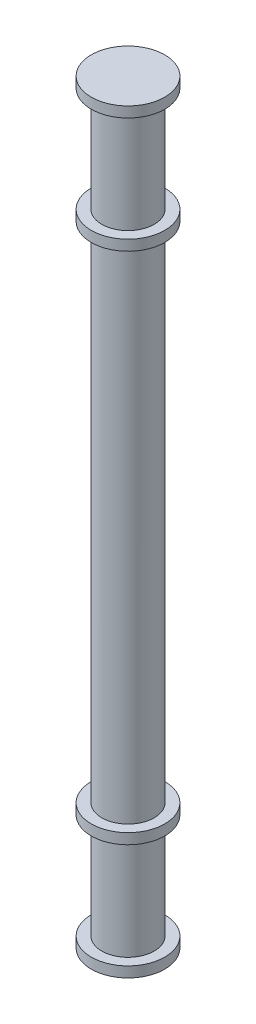
ISO-10303-21;
HEADER;
FILE_DESCRIPTION(('STEP AP214'),'2;1');
FILE_NAME('part.step','',(''),(''),'','','');
FILE_SCHEMA(('AUTOMOTIVE_DESIGN { 1 0 10303 214 1 1 1 1 }'));
ENDSEC;
DATA;
#1=APPLICATION_CONTEXT('core data for automotive mechanical design processes');
#2=APPLICATION_PROTOCOL_DEFINITION('international standard','automotive_design',2000,#1);
#3=PRODUCT_CONTEXT('',#1,'mechanical');
#4=PRODUCT('Part','Part','',(#3));
#5=PRODUCT_RELATED_PRODUCT_CATEGORY('part','',(#4));
#6=PRODUCT_DEFINITION_FORMATION('','',#4);
#7=PRODUCT_DEFINITION_CONTEXT('part definition',#1,'design');
#8=PRODUCT_DEFINITION('design','',#6,#7);
#9=PRODUCT_DEFINITION_SHAPE('','',#8);
#10=(LENGTH_UNIT() NAMED_UNIT(*) SI_UNIT(.MILLI.,.METRE.));
#11=(NAMED_UNIT(*) PLANE_ANGLE_UNIT() SI_UNIT($,.RADIAN.));
#12=(NAMED_UNIT(*) SI_UNIT($,.STERADIAN.) SOLID_ANGLE_UNIT());
#13=UNCERTAINTY_MEASURE_WITH_UNIT(LENGTH_MEASURE(1.E-05),#10,'distance_accuracy_value','');
#14=(GEOMETRIC_REPRESENTATION_CONTEXT(3) GLOBAL_UNCERTAINTY_ASSIGNED_CONTEXT((#13)) GLOBAL_UNIT_ASSIGNED_CONTEXT((#10,
#11,#12)) REPRESENTATION_CONTEXT('',''));
#15=CARTESIAN_POINT('',(0.,0.,0.));
#16=DIRECTION('',(0.,0.,1.));
#17=DIRECTION('',(1.,0.,0.));
#18=AXIS2_PLACEMENT_3D('',#15,#16,#17);
#19=CARTESIAN_POINT('',(0.,120.,1.15660100583352));
#20=DIRECTION('',(0.,1.,0.));
#21=DIRECTION('',(0.,0.,1.));
#22=AXIS2_PLACEMENT_3D('',#19,#20,#21);
#23=CYLINDRICAL_SURFACE('',#22,7.);
#24=CARTESIAN_POINT('',(0.,120.,1.15660100583352));
#25=DIRECTION('',(0.,1.,0.));
#26=DIRECTION('',(1.,0.,0.));
#27=AXIS2_PLACEMENT_3D('',#24,#25,#26);
#28=CIRCLE('',#27,7.);
#29=CARTESIAN_POINT('',(7.,120.,1.15660100583352));
#30=VERTEX_POINT('',#29);
#31=EDGE_CURVE('E12',#30,#30,#28,.T.);
#32=ORIENTED_EDGE('',*,*,#31,.T.);
#33=EDGE_LOOP('',(#32));
#34=FACE_BOUND('',#33,.T.);
#35=CARTESIAN_POINT('',(0.,122.,1.15660100583352));
#36=DIRECTION('',(0.,1.,0.));
#37=DIRECTION('',(1.,0.,0.));
#38=AXIS2_PLACEMENT_3D('',#35,#36,#37);
#39=CIRCLE('',#38,7.);
#40=CARTESIAN_POINT('',(7.,122.,1.15660100583352));
#41=VERTEX_POINT('',#40);
#42=EDGE_CURVE('E72',#41,#41,#39,.T.);
#43=ORIENTED_EDGE('',*,*,#42,.F.);
#44=EDGE_LOOP('',(#43));
#45=FACE_BOUND('',#44,.T.);
#46=ADVANCED_FACE('F69',(#34,#45),#23,.T.);
#47=CARTESIAN_POINT('',(0.,120.,1.15660100583352));
#48=DIRECTION('',(0.,1.,0.));
#49=DIRECTION('',(0.,0.,1.));
#50=AXIS2_PLACEMENT_3D('',#47,#48,#49);
#51=PLANE('',#50);
#52=CARTESIAN_POINT('',(0.,120.,1.15660100583352));
#53=DIRECTION('',(0.,1.,0.));
#54=DIRECTION('',(0.,0.,1.));
#55=AXIS2_PLACEMENT_3D('',#52,#53,#54);
#56=CIRCLE('',#55,5.);
#57=CARTESIAN_POINT('',(0.,120.,6.15660100583352));
#58=VERTEX_POINT('',#57);
#59=EDGE_CURVE('E79',#58,#58,#56,.T.);
#60=ORIENTED_EDGE('',*,*,#59,.T.);
#61=EDGE_LOOP('',(#60));
#62=FACE_BOUND('',#61,.T.);
#63=ORIENTED_EDGE('',*,*,#31,.F.);
#64=EDGE_LOOP('',(#63));
#65=FACE_BOUND('',#64,.T.);
#66=ADVANCED_FACE('F87',(#62,#65),#51,.F.);
#67=CARTESIAN_POINT('',(0.,122.,1.15660100583352));
#68=DIRECTION('',(0.,1.,0.));
#69=DIRECTION('',(0.,0.,1.));
#70=AXIS2_PLACEMENT_3D('',#67,#68,#69);
#71=PLANE('',#70);
#72=CARTESIAN_POINT('',(0.,122.,1.15660100583352));
#73=DIRECTION('',(0.,1.,0.));
#74=DIRECTION('',(0.,0.,1.));
#75=AXIS2_PLACEMENT_3D('',#72,#73,#74);
#76=CIRCLE('',#75,5.);
#77=CARTESIAN_POINT('',(0.,122.,6.15660100583352));
#78=VERTEX_POINT('',#77);
#79=EDGE_CURVE('E81',#78,#78,#76,.T.);
#80=ORIENTED_EDGE('',*,*,#79,.F.);
#81=EDGE_LOOP('',(#80));
#82=FACE_BOUND('',#81,.T.);
#83=ORIENTED_EDGE('',*,*,#42,.T.);
#84=EDGE_LOOP('',(#83));
#85=FACE_BOUND('',#84,.T.);
#86=ADVANCED_FACE('F93',(#82,#85),#71,.T.);
#87=CARTESIAN_POINT('',(0.,120.,1.15660100583352));
#88=DIRECTION('',(0.,1.,0.));
#89=DIRECTION('',(0.,0.,1.));
#90=AXIS2_PLACEMENT_3D('',#87,#88,#89);
#91=CYLINDRICAL_SURFACE('',#90,5.);
#92=ORIENTED_EDGE('',*,*,#59,.F.);
#93=EDGE_LOOP('',(#92));
#94=FACE_BOUND('',#93,.T.);
#95=ORIENTED_EDGE('',*,*,#79,.T.);
#96=EDGE_LOOP('',(#95));
#97=FACE_BOUND('',#96,.T.);
#98=ADVANCED_FACE('F90',(#94,#97),#91,.F.);
#99=CLOSED_SHELL('',(#46,#66,#86,#98));
#100=MANIFOLD_SOLID_BREP('B2',#99);
#101=CARTESIAN_POINT('',(0.,144.,1.15660100583352));
#102=DIRECTION('',(0.,-1.,0.));
#103=DIRECTION('',(0.,0.,-1.));
#104=AXIS2_PLACEMENT_3D('',#101,#102,#103);
#105=CYLINDRICAL_SURFACE('',#104,5.);
#106=CARTESIAN_POINT('',(0.,142.,1.15660100583352));
#107=DIRECTION('',(0.,1.,0.));
#108=DIRECTION('',(0.,0.,1.));
#109=AXIS2_PLACEMENT_3D('',#106,#107,#108);
#110=CIRCLE('',#109,5.);
#111=CARTESIAN_POINT('',(0.,142.,6.15660100583352));
#112=VERTEX_POINT('',#111);
#113=EDGE_CURVE('E142',#112,#112,#110,.T.);
#114=ORIENTED_EDGE('',*,*,#113,.F.);
#115=EDGE_LOOP('',(#114));
#116=FACE_BOUND('',#115,.T.);
#117=CARTESIAN_POINT('',(0.,24.,1.15660100583352));
#118=DIRECTION('',(0.,-1.,0.));
#119=DIRECTION('',(0.,0.,-1.));
#120=AXIS2_PLACEMENT_3D('',#117,#118,#119);
#121=CIRCLE('',#120,5.);
#122=CARTESIAN_POINT('',(0.,24.,-3.84339899416648));
#123=VERTEX_POINT('',#122);
#124=EDGE_CURVE('E68',#123,#123,#121,.T.);
#125=ORIENTED_EDGE('',*,*,#124,.F.);
#126=EDGE_LOOP('',(#125));
#127=FACE_BOUND('',#126,.T.);
#128=ADVANCED_FACE('F131',(#116,#127),#105,.T.);
#129=CARTESIAN_POINT('',(0.,142.,1.15660100583352));
#130=DIRECTION('',(0.,1.,0.));
#131=DIRECTION('',(0.,0.,1.));
#132=AXIS2_PLACEMENT_3D('',#129,#130,#131);
#133=CYLINDRICAL_SURFACE('',#132,7.);
#134=CARTESIAN_POINT('',(0.,142.,1.15660100583352));
#135=DIRECTION('',(0.,1.,0.));
#136=DIRECTION('',(1.,0.,0.));
#137=AXIS2_PLACEMENT_3D('',#134,#135,#136);
#138=CIRCLE('',#137,7.);
#139=CARTESIAN_POINT('',(7.,142.,1.15660100583352));
#140=VERTEX_POINT('',#139);
#141=EDGE_CURVE('E146',#140,#140,#138,.T.);
#142=ORIENTED_EDGE('',*,*,#141,.T.);
#143=EDGE_LOOP('',(#142));
#144=FACE_BOUND('',#143,.T.);
#145=CARTESIAN_POINT('',(0.,144.,1.15660100583352));
#146=DIRECTION('',(0.,1.,0.));
#147=DIRECTION('',(1.,0.,0.));
#148=AXIS2_PLACEMENT_3D('',#145,#146,#147);
#149=CIRCLE('',#148,7.);
#150=CARTESIAN_POINT('',(7.,144.,1.15660100583352));
#151=VERTEX_POINT('',#150);
#152=EDGE_CURVE('E149',#151,#151,#149,.T.);
#153=ORIENTED_EDGE('',*,*,#152,.F.);
#154=EDGE_LOOP('',(#153));
#155=FACE_BOUND('',#154,.T.);
#156=ADVANCED_FACE('F195',(#144,#155),#133,.T.);
#157=CARTESIAN_POINT('',(0.,142.,1.15660100583352));
#158=DIRECTION('',(0.,1.,0.));
#159=DIRECTION('',(0.,0.,1.));
#160=AXIS2_PLACEMENT_3D('',#157,#158,#159);
#161=PLANE('',#160);
#162=ORIENTED_EDGE('',*,*,#113,.T.);
#163=EDGE_LOOP('',(#162));
#164=FACE_BOUND('',#163,.T.);
#165=ORIENTED_EDGE('',*,*,#141,.F.);
#166=EDGE_LOOP('',(#165));
#167=FACE_BOUND('',#166,.T.);
#168=ADVANCED_FACE('F191',(#164,#167),#161,.F.);
#169=CARTESIAN_POINT('',(0.,144.,1.15660100583352));
#170=DIRECTION('',(0.,1.,0.));
#171=DIRECTION('',(0.,0.,1.));
#172=AXIS2_PLACEMENT_3D('',#169,#170,#171);
#173=PLANE('',#172);
#174=ORIENTED_EDGE('',*,*,#152,.T.);
#175=EDGE_LOOP('',(#174));
#176=FACE_BOUND('',#175,.T.);
#177=ADVANCED_FACE('F182',(#176),#173,.T.);
#178=CARTESIAN_POINT('',(0.,24.,1.15660100583352));
#179=DIRECTION('',(0.,-1.,0.));
#180=DIRECTION('',(0.,0.,-1.));
#181=AXIS2_PLACEMENT_3D('',#178,#179,#180);
#182=CYLINDRICAL_SURFACE('',#181,7.);
#183=CARTESIAN_POINT('',(0.,24.,1.15660100583352));
#184=DIRECTION('',(0.,-1.,0.));
#185=DIRECTION('',(-1.,0.,0.));
#186=AXIS2_PLACEMENT_3D('',#183,#184,#185);
#187=CIRCLE('',#186,7.);
#188=CARTESIAN_POINT('',(-7.,24.,1.15660100583352));
#189=VERTEX_POINT('',#188);
#190=EDGE_CURVE('E158',#189,#189,#187,.T.);
#191=ORIENTED_EDGE('',*,*,#190,.T.);
#192=EDGE_LOOP('',(#191));
#193=FACE_BOUND('',#192,.T.);
#194=CARTESIAN_POINT('',(0.,22.,1.15660100583352));
#195=DIRECTION('',(0.,-1.,0.));
#196=DIRECTION('',(-1.,0.,0.));
#197=AXIS2_PLACEMENT_3D('',#194,#195,#196);
#198=CIRCLE('',#197,7.);
#199=CARTESIAN_POINT('',(-7.,22.,1.15660100583352));
#200=VERTEX_POINT('',#199);
#201=EDGE_CURVE('E161',#200,#200,#198,.T.);
#202=ORIENTED_EDGE('',*,*,#201,.F.);
#203=EDGE_LOOP('',(#202));
#204=FACE_BOUND('',#203,.T.);
#205=ADVANCED_FACE('F180',(#193,#204),#182,.T.);
#206=CARTESIAN_POINT('',(0.,24.,1.15660100583352));
#207=DIRECTION('',(0.,-1.,0.));
#208=DIRECTION('',(0.,0.,-1.));
#209=AXIS2_PLACEMENT_3D('',#206,#207,#208);
#210=PLANE('',#209);
#211=ORIENTED_EDGE('',*,*,#124,.T.);
#212=EDGE_LOOP('',(#211));
#213=FACE_BOUND('',#212,.T.);
#214=ORIENTED_EDGE('',*,*,#190,.F.);
#215=EDGE_LOOP('',(#214));
#216=FACE_BOUND('',#215,.T.);
#217=ADVANCED_FACE('F176',(#213,#216),#210,.F.);
#218=CARTESIAN_POINT('',(0.,22.,1.15660100583352));
#219=DIRECTION('',(0.,-1.,0.));
#220=DIRECTION('',(0.,0.,-1.));
#221=AXIS2_PLACEMENT_3D('',#218,#219,#220);
#222=PLANE('',#221);
#223=CARTESIAN_POINT('',(0.,22.,1.15660100583352));
#224=DIRECTION('',(0.,-1.,0.));
#225=DIRECTION('',(0.,0.,-1.));
#226=AXIS2_PLACEMENT_3D('',#223,#224,#225);
#227=CIRCLE('',#226,5.);
#228=CARTESIAN_POINT('',(0.,22.,-3.84339899416648));
#229=VERTEX_POINT('',#228);
#230=EDGE_CURVE('E164',#229,#229,#227,.T.);
#231=ORIENTED_EDGE('',*,*,#230,.F.);
#232=EDGE_LOOP('',(#231));
#233=FACE_BOUND('',#232,.T.);
#234=ORIENTED_EDGE('',*,*,#201,.T.);
#235=EDGE_LOOP('',(#234));
#236=FACE_BOUND('',#235,.T.);
#237=ADVANCED_FACE('F172',(#233,#236),#222,.T.);
#238=CARTESIAN_POINT('',(0.,0.,1.15660100583352));
#239=DIRECTION('',(0.,1.,0.));
#240=DIRECTION('',(0.,0.,1.));
#241=AXIS2_PLACEMENT_3D('',#238,#239,#240);
#242=PLANE('',#241);
#243=CARTESIAN_POINT('',(0.,0.,1.15660100583352));
#244=DIRECTION('',(0.,-1.,0.));
#245=DIRECTION('',(1.,0.,0.));
#246=AXIS2_PLACEMENT_3D('',#243,#244,#245);
#247=CIRCLE('',#246,7.);
#248=CARTESIAN_POINT('',(7.,0.,1.15660100583352));
#249=VERTEX_POINT('',#248);
#250=EDGE_CURVE('E155',#249,#249,#247,.T.);
#251=ORIENTED_EDGE('',*,*,#250,.T.);
#252=EDGE_LOOP('',(#251));
#253=FACE_BOUND('',#252,.T.);
#254=ADVANCED_FACE('F175',(#253),#242,.F.);
#255=CARTESIAN_POINT('',(0.,2.,1.15660100583352));
#256=DIRECTION('',(0.,-1.,0.));
#257=DIRECTION('',(0.,0.,-1.));
#258=AXIS2_PLACEMENT_3D('',#255,#256,#257);
#259=CYLINDRICAL_SURFACE('',#258,7.);
#260=CARTESIAN_POINT('',(0.,2.,1.15660100583352));
#261=DIRECTION('',(0.,-1.,0.));
#262=DIRECTION('',(1.,0.,0.));
#263=AXIS2_PLACEMENT_3D('',#260,#261,#262);
#264=CIRCLE('',#263,7.);
#265=CARTESIAN_POINT('',(7.,2.,1.15660100583352));
#266=VERTEX_POINT('',#265);
#267=EDGE_CURVE('E152',#266,#266,#264,.T.);
#268=ORIENTED_EDGE('',*,*,#267,.T.);
#269=EDGE_LOOP('',(#268));
#270=FACE_BOUND('',#269,.T.);
#271=ORIENTED_EDGE('',*,*,#250,.F.);
#272=EDGE_LOOP('',(#271));
#273=FACE_BOUND('',#272,.T.);
#274=ADVANCED_FACE('F210',(#270,#273),#259,.T.);
#275=CARTESIAN_POINT('',(0.,2.,1.15660100583352));
#276=DIRECTION('',(0.,-1.,0.));
#277=DIRECTION('',(0.,0.,-1.));
#278=AXIS2_PLACEMENT_3D('',#275,#276,#277);
#279=PLANE('',#278);
#280=CARTESIAN_POINT('',(0.,2.,1.15660100583352));
#281=DIRECTION('',(0.,-1.,0.));
#282=DIRECTION('',(0.,0.,-1.));
#283=AXIS2_PLACEMENT_3D('',#280,#281,#282);
#284=CIRCLE('',#283,5.);
#285=CARTESIAN_POINT('',(0.,2.,-3.84339899416648));
#286=VERTEX_POINT('',#285);
#287=EDGE_CURVE('E138',#286,#286,#284,.T.);
#288=ORIENTED_EDGE('',*,*,#287,.T.);
#289=EDGE_LOOP('',(#288));
#290=FACE_BOUND('',#289,.T.);
#291=ORIENTED_EDGE('',*,*,#267,.F.);
#292=EDGE_LOOP('',(#291));
#293=FACE_BOUND('',#292,.T.);
#294=ADVANCED_FACE('F206',(#290,#293),#279,.F.);
#295=ORIENTED_EDGE('',*,*,#230,.T.);
#296=EDGE_LOOP('',(#295));
#297=FACE_BOUND('',#296,.T.);
#298=ORIENTED_EDGE('',*,*,#287,.F.);
#299=EDGE_LOOP('',(#298));
#300=FACE_BOUND('',#299,.T.);
#301=ADVANCED_FACE('F133',(#297,#300),#105,.T.);
#302=CLOSED_SHELL('',(#128,#156,#168,#177,#205,#217,#237,#254,#274,#294,#301));
#303=MANIFOLD_SOLID_BREP('B7',#302);
#304=ADVANCED_BREP_SHAPE_REPRESENTATION('',(#18,#100,#303),#14);
#305=SHAPE_DEFINITION_REPRESENTATION(#9,#304);
ENDSEC;
END-ISO-10303-21;
